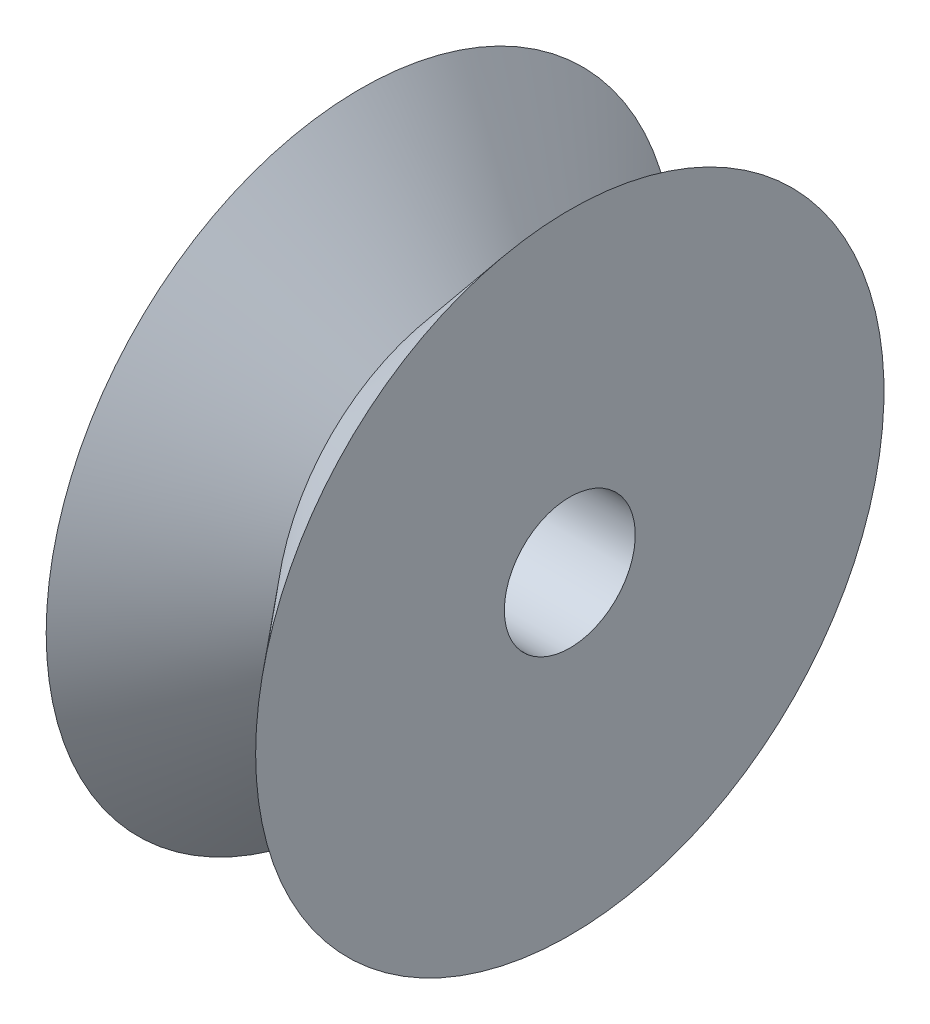
ISO-10303-21;
HEADER;
FILE_DESCRIPTION(('STEP AP214'),'2;1');
FILE_NAME('part.step','',(''),(''),'','','');
FILE_SCHEMA(('AUTOMOTIVE_DESIGN { 1 0 10303 214 1 1 1 1 }'));
ENDSEC;
DATA;
#1=APPLICATION_CONTEXT('core data for automotive mechanical design processes');
#2=APPLICATION_PROTOCOL_DEFINITION('international standard','automotive_design',2000,#1);
#3=PRODUCT_CONTEXT('',#1,'mechanical');
#4=PRODUCT('Part','Part','',(#3));
#5=PRODUCT_RELATED_PRODUCT_CATEGORY('part','',(#4));
#6=PRODUCT_DEFINITION_FORMATION('','',#4);
#7=PRODUCT_DEFINITION_CONTEXT('part definition',#1,'design');
#8=PRODUCT_DEFINITION('design','',#6,#7);
#9=PRODUCT_DEFINITION_SHAPE('','',#8);
#10=(LENGTH_UNIT() NAMED_UNIT(*) SI_UNIT(.MILLI.,.METRE.));
#11=(NAMED_UNIT(*) PLANE_ANGLE_UNIT() SI_UNIT($,.RADIAN.));
#12=(NAMED_UNIT(*) SI_UNIT($,.STERADIAN.) SOLID_ANGLE_UNIT());
#13=UNCERTAINTY_MEASURE_WITH_UNIT(LENGTH_MEASURE(1.E-05),#10,'distance_accuracy_value','');
#14=(GEOMETRIC_REPRESENTATION_CONTEXT(3) GLOBAL_UNCERTAINTY_ASSIGNED_CONTEXT((#13)) GLOBAL_UNIT_ASSIGNED_CONTEXT((#10,
#11,#12)) REPRESENTATION_CONTEXT('',''));
#15=CARTESIAN_POINT('',(0.,0.,0.));
#16=DIRECTION('',(0.,0.,1.));
#17=DIRECTION('',(1.,0.,0.));
#18=AXIS2_PLACEMENT_3D('',#15,#16,#17);
#19=CARTESIAN_POINT('',(-4.,0.,0.));
#20=DIRECTION('',(1.,0.,0.));
#21=DIRECTION('',(0.,0.,-1.));
#22=AXIS2_PLACEMENT_3D('',#19,#20,#21);
#23=PLANE('',#22);
#24=CARTESIAN_POINT('',(-4.,0.,0.));
#25=DIRECTION('',(-1.,0.,0.));
#26=DIRECTION('',(0.,0.,1.));
#27=AXIS2_PLACEMENT_3D('',#24,#25,#26);
#28=CIRCLE('',#27,2.5);
#29=CARTESIAN_POINT('',(-4.,0.,2.5));
#30=VERTEX_POINT('',#29);
#31=EDGE_CURVE('E56',#30,#30,#28,.T.);
#32=ORIENTED_EDGE('',*,*,#31,.F.);
#33=EDGE_LOOP('',(#32));
#34=FACE_BOUND('',#33,.T.);
#35=CARTESIAN_POINT('',(-4.,0.,0.));
#36=DIRECTION('',(-1.,0.,0.));
#37=DIRECTION('',(0.,0.,1.));
#38=AXIS2_PLACEMENT_3D('',#35,#36,#37);
#39=CIRCLE('',#38,12.);
#40=CARTESIAN_POINT('',(-4.,0.,12.));
#41=VERTEX_POINT('',#40);
#42=EDGE_CURVE('E50',#41,#41,#39,.T.);
#43=ORIENTED_EDGE('',*,*,#42,.T.);
#44=EDGE_LOOP('',(#43));
#45=FACE_BOUND('',#44,.T.);
#46=ADVANCED_FACE('F37',(#34,#45),#23,.F.);
#47=CARTESIAN_POINT('',(4.,0.,0.));
#48=DIRECTION('',(-1.,0.,0.));
#49=DIRECTION('',(0.,0.,1.));
#50=AXIS2_PLACEMENT_3D('',#47,#48,#49);
#51=PLANE('',#50);
#52=CARTESIAN_POINT('',(4.,0.,0.));
#53=DIRECTION('',(-1.,0.,0.));
#54=DIRECTION('',(0.,0.,1.));
#55=AXIS2_PLACEMENT_3D('',#52,#53,#54);
#56=CIRCLE('',#55,2.5);
#57=CARTESIAN_POINT('',(4.,0.,2.5));
#58=VERTEX_POINT('',#57);
#59=EDGE_CURVE('E40',#58,#58,#56,.T.);
#60=ORIENTED_EDGE('',*,*,#59,.T.);
#61=EDGE_LOOP('',(#60));
#62=FACE_BOUND('',#61,.T.);
#63=CARTESIAN_POINT('',(4.,0.,0.));
#64=DIRECTION('',(-1.,0.,0.));
#65=DIRECTION('',(0.,0.,1.));
#66=AXIS2_PLACEMENT_3D('',#63,#64,#65);
#67=CIRCLE('',#66,12.);
#68=CARTESIAN_POINT('',(4.,0.,12.));
#69=VERTEX_POINT('',#68);
#70=EDGE_CURVE('E10',#69,#69,#67,.T.);
#71=ORIENTED_EDGE('',*,*,#70,.F.);
#72=EDGE_LOOP('',(#71));
#73=FACE_BOUND('',#72,.T.);
#74=ADVANCED_FACE('F65',(#62,#73),#51,.F.);
#75=CARTESIAN_POINT('',(4.,0.,0.));
#76=DIRECTION('',(1.,0.,0.));
#77=DIRECTION('',(0.,0.,-1.));
#78=AXIS2_PLACEMENT_3D('',#75,#76,#77);
#79=CONICAL_SURFACE('',#78,12.,0.872664625997171);
#80=CARTESIAN_POINT('',(0.,0.,0.));
#81=DIRECTION('',(-1.,0.,0.));
#82=DIRECTION('',(0.,0.,1.));
#83=AXIS2_PLACEMENT_3D('',#80,#81,#82);
#84=CIRCLE('',#83,7.2329856296231);
#85=CARTESIAN_POINT('',(0.,0.,7.2329856296231));
#86=VERTEX_POINT('',#85);
#87=EDGE_CURVE('E45',#86,#86,#84,.T.);
#88=ORIENTED_EDGE('',*,*,#87,.F.);
#89=EDGE_LOOP('',(#88));
#90=FACE_BOUND('',#89,.T.);
#91=ORIENTED_EDGE('',*,*,#70,.T.);
#92=EDGE_LOOP('',(#91));
#93=FACE_BOUND('',#92,.T.);
#94=ADVANCED_FACE('F75',(#90,#93),#79,.T.);
#95=CARTESIAN_POINT('',(0.,0.,0.));
#96=DIRECTION('',(-1.,0.,0.));
#97=DIRECTION('',(0.,0.,1.));
#98=AXIS2_PLACEMENT_3D('',#95,#96,#97);
#99=CONICAL_SURFACE('',#98,7.2329856296231,0.87266462599717);
#100=ORIENTED_EDGE('',*,*,#42,.F.);
#101=EDGE_LOOP('',(#100));
#102=FACE_BOUND('',#101,.T.);
#103=ORIENTED_EDGE('',*,*,#87,.T.);
#104=EDGE_LOOP('',(#103));
#105=FACE_BOUND('',#104,.T.);
#106=ADVANCED_FACE('F70',(#102,#105),#99,.T.);
#107=CARTESIAN_POINT('',(6.,0.,0.));
#108=DIRECTION('',(-1.,0.,0.));
#109=DIRECTION('',(0.,0.,1.));
#110=AXIS2_PLACEMENT_3D('',#107,#108,#109);
#111=CYLINDRICAL_SURFACE('',#110,2.5);
#112=ORIENTED_EDGE('',*,*,#31,.T.);
#113=EDGE_LOOP('',(#112));
#114=FACE_BOUND('',#113,.T.);
#115=ORIENTED_EDGE('',*,*,#59,.F.);
#116=EDGE_LOOP('',(#115));
#117=FACE_BOUND('',#116,.T.);
#118=ADVANCED_FACE('F68',(#114,#117),#111,.F.);
#119=CLOSED_SHELL('',(#46,#74,#94,#106,#118));
#120=MANIFOLD_SOLID_BREP('B2',#119);
#121=ADVANCED_BREP_SHAPE_REPRESENTATION('',(#18,#120),#14);
#122=SHAPE_DEFINITION_REPRESENTATION(#9,#121);
ENDSEC;
END-ISO-10303-21;
